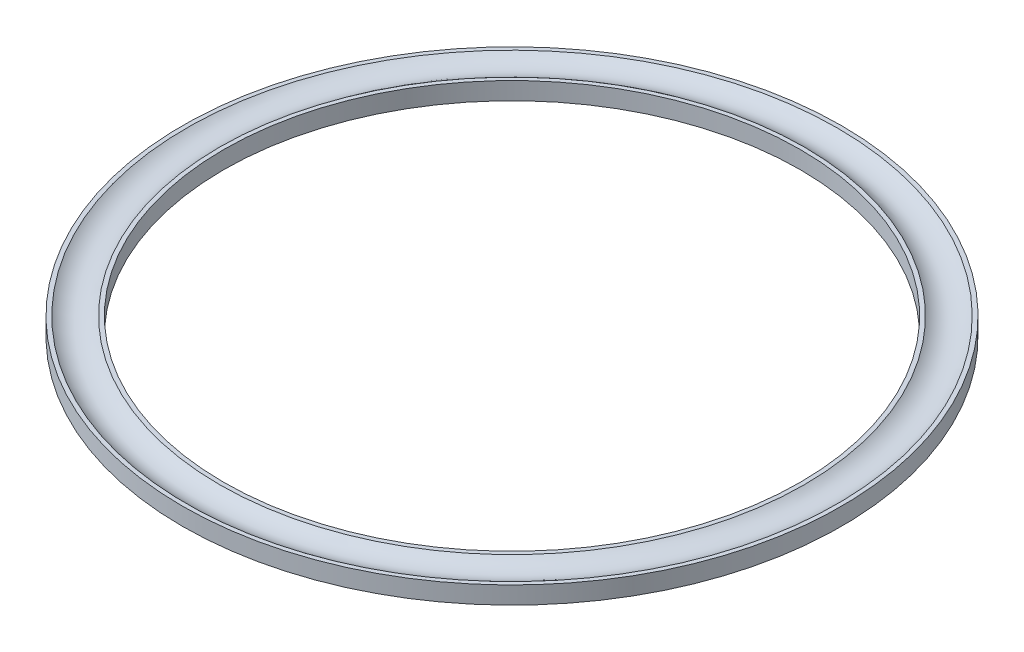
ISO-10303-21;
HEADER;
FILE_DESCRIPTION(('STEP AP214'),'2;1');
FILE_NAME('part.step','',(''),(''),'','','');
FILE_SCHEMA(('AUTOMOTIVE_DESIGN { 1 0 10303 214 1 1 1 1 }'));
ENDSEC;
DATA;
#1=APPLICATION_CONTEXT('core data for automotive mechanical design processes');
#2=APPLICATION_PROTOCOL_DEFINITION('international standard','automotive_design',2000,#1);
#3=PRODUCT_CONTEXT('',#1,'mechanical');
#4=PRODUCT('Part','Part','',(#3));
#5=PRODUCT_RELATED_PRODUCT_CATEGORY('part','',(#4));
#6=PRODUCT_DEFINITION_FORMATION('','',#4);
#7=PRODUCT_DEFINITION_CONTEXT('part definition',#1,'design');
#8=PRODUCT_DEFINITION('design','',#6,#7);
#9=PRODUCT_DEFINITION_SHAPE('','',#8);
#10=(LENGTH_UNIT() NAMED_UNIT(*) SI_UNIT(.MILLI.,.METRE.));
#11=(NAMED_UNIT(*) PLANE_ANGLE_UNIT() SI_UNIT($,.RADIAN.));
#12=(NAMED_UNIT(*) SI_UNIT($,.STERADIAN.) SOLID_ANGLE_UNIT());
#13=UNCERTAINTY_MEASURE_WITH_UNIT(LENGTH_MEASURE(1.E-05),#10,'distance_accuracy_value','');
#14=(GEOMETRIC_REPRESENTATION_CONTEXT(3) GLOBAL_UNCERTAINTY_ASSIGNED_CONTEXT((#13)) GLOBAL_UNIT_ASSIGNED_CONTEXT((#10,
#11,#12)) REPRESENTATION_CONTEXT('',''));
#15=CARTESIAN_POINT('',(0.,0.,0.));
#16=DIRECTION('',(0.,0.,1.));
#17=DIRECTION('',(1.,0.,0.));
#18=AXIS2_PLACEMENT_3D('',#15,#16,#17);
#19=CARTESIAN_POINT('',(23.9141,0.634999999999999,0.));
#20=DIRECTION('',(0.,1.,0.));
#21=DIRECTION('',(0.,0.,1.));
#22=AXIS2_PLACEMENT_3D('',#19,#20,#21);
#23=PLANE('',#22);
#24=CARTESIAN_POINT('',(0.,0.634999999999998,0.));
#25=DIRECTION('',(0.,-1.,0.));
#26=DIRECTION('',(0.,0.,-1.));
#27=AXIS2_PLACEMENT_3D('',#24,#25,#26);
#28=CIRCLE('',#27,23.61438);
#29=CARTESIAN_POINT('',(0.,0.634999999999998,-23.61438));
#30=VERTEX_POINT('',#29);
#31=EDGE_CURVE('E10',#30,#30,#28,.T.);
#32=ORIENTED_EDGE('',*,*,#31,.T.);
#33=EDGE_LOOP('',(#32));
#34=FACE_BOUND('',#33,.T.);
#35=CARTESIAN_POINT('',(0.,0.635,0.));
#36=DIRECTION('',(0.,-1.,0.));
#37=DIRECTION('',(0.,0.,-1.));
#38=AXIS2_PLACEMENT_3D('',#35,#36,#37);
#39=CIRCLE('',#38,23.9141);
#40=CARTESIAN_POINT('',(0.,0.635,-23.9141));
#41=VERTEX_POINT('',#40);
#42=EDGE_CURVE('E54',#41,#41,#39,.T.);
#43=ORIENTED_EDGE('',*,*,#42,.F.);
#44=EDGE_LOOP('',(#43));
#45=FACE_BOUND('',#44,.T.);
#46=ADVANCED_FACE('F32',(#34,#45),#23,.T.);
#47=CARTESIAN_POINT('',(0.,2.04008712643679,0.));
#48=DIRECTION('',(0.,-1.,0.));
#49=DIRECTION('',(0.,0.,-1.));
#50=AXIS2_PLACEMENT_3D('',#47,#48,#49);
#51=TOROIDAL_SURFACE('',#50,22.4155,1.84704712643679);
#52=CARTESIAN_POINT('',(0.,0.634999999999998,0.));
#53=DIRECTION('',(0.,-1.,0.));
#54=DIRECTION('',(0.,0.,-1.));
#55=AXIS2_PLACEMENT_3D('',#52,#53,#54);
#56=CIRCLE('',#55,21.21662);
#57=CARTESIAN_POINT('',(0.,0.634999999999998,-21.21662));
#58=VERTEX_POINT('',#57);
#59=EDGE_CURVE('E38',#58,#58,#56,.T.);
#60=ORIENTED_EDGE('',*,*,#59,.T.);
#61=EDGE_LOOP('',(#60));
#62=FACE_BOUND('',#61,.T.);
#63=ORIENTED_EDGE('',*,*,#31,.F.);
#64=EDGE_LOOP('',(#63));
#65=FACE_BOUND('',#64,.T.);
#66=ADVANCED_FACE('F62',(#62,#65),#51,.F.);
#67=CARTESIAN_POINT('',(20.9169,0.634999999999999,0.));
#68=DIRECTION('',(0.,1.,0.));
#69=DIRECTION('',(0.,0.,1.));
#70=AXIS2_PLACEMENT_3D('',#67,#68,#69);
#71=PLANE('',#70);
#72=CARTESIAN_POINT('',(0.,0.635,0.));
#73=DIRECTION('',(0.,-1.,0.));
#74=DIRECTION('',(0.,0.,-1.));
#75=AXIS2_PLACEMENT_3D('',#72,#73,#74);
#76=CIRCLE('',#75,20.9169);
#77=CARTESIAN_POINT('',(0.,0.635,-20.9169));
#78=VERTEX_POINT('',#77);
#79=EDGE_CURVE('E42',#78,#78,#76,.T.);
#80=ORIENTED_EDGE('',*,*,#79,.T.);
#81=EDGE_LOOP('',(#80));
#82=FACE_BOUND('',#81,.T.);
#83=ORIENTED_EDGE('',*,*,#59,.F.);
#84=EDGE_LOOP('',(#83));
#85=FACE_BOUND('',#84,.T.);
#86=ADVANCED_FACE('F66',(#82,#85),#71,.T.);
#87=CARTESIAN_POINT('',(0.,-11.4126253664222,0.));
#88=DIRECTION('',(0.,-1.,0.));
#89=DIRECTION('',(0.,0.,-1.));
#90=AXIS2_PLACEMENT_3D('',#87,#88,#89);
#91=CYLINDRICAL_SURFACE('',#90,20.9169);
#92=CARTESIAN_POINT('',(0.,-0.635,0.));
#93=DIRECTION('',(0.,-1.,0.));
#94=DIRECTION('',(0.,0.,-1.));
#95=AXIS2_PLACEMENT_3D('',#92,#93,#94);
#96=CIRCLE('',#95,20.9169);
#97=CARTESIAN_POINT('',(0.,-0.635,-20.9169));
#98=VERTEX_POINT('',#97);
#99=EDGE_CURVE('E46',#98,#98,#96,.T.);
#100=ORIENTED_EDGE('',*,*,#99,.T.);
#101=EDGE_LOOP('',(#100));
#102=FACE_BOUND('',#101,.T.);
#103=ORIENTED_EDGE('',*,*,#79,.F.);
#104=EDGE_LOOP('',(#103));
#105=FACE_BOUND('',#104,.T.);
#106=ADVANCED_FACE('F70',(#102,#105),#91,.F.);
#107=CARTESIAN_POINT('',(23.9141,-0.635,0.));
#108=DIRECTION('',(0.,-1.,0.));
#109=DIRECTION('',(0.,0.,-1.));
#110=AXIS2_PLACEMENT_3D('',#107,#108,#109);
#111=PLANE('',#110);
#112=CARTESIAN_POINT('',(0.,-0.635,0.));
#113=DIRECTION('',(0.,-1.,0.));
#114=DIRECTION('',(0.,0.,-1.));
#115=AXIS2_PLACEMENT_3D('',#112,#113,#114);
#116=CIRCLE('',#115,23.9141);
#117=CARTESIAN_POINT('',(0.,-0.635,-23.9141));
#118=VERTEX_POINT('',#117);
#119=EDGE_CURVE('E51',#118,#118,#116,.T.);
#120=ORIENTED_EDGE('',*,*,#119,.T.);
#121=EDGE_LOOP('',(#120));
#122=FACE_BOUND('',#121,.T.);
#123=ORIENTED_EDGE('',*,*,#99,.F.);
#124=EDGE_LOOP('',(#123));
#125=FACE_BOUND('',#124,.T.);
#126=ADVANCED_FACE('F77',(#122,#125),#111,.T.);
#127=CARTESIAN_POINT('',(0.,-11.4126253664222,0.));
#128=DIRECTION('',(0.,-1.,0.));
#129=DIRECTION('',(0.,0.,-1.));
#130=AXIS2_PLACEMENT_3D('',#127,#128,#129);
#131=CYLINDRICAL_SURFACE('',#130,23.9141);
#132=ORIENTED_EDGE('',*,*,#42,.T.);
#133=EDGE_LOOP('',(#132));
#134=FACE_BOUND('',#133,.T.);
#135=ORIENTED_EDGE('',*,*,#119,.F.);
#136=EDGE_LOOP('',(#135));
#137=FACE_BOUND('',#136,.T.);
#138=ADVANCED_FACE('F58',(#134,#137),#131,.T.);
#139=CLOSED_SHELL('',(#46,#66,#86,#106,#126,#138));
#140=MANIFOLD_SOLID_BREP('B2',#139);
#141=ADVANCED_BREP_SHAPE_REPRESENTATION('',(#18,#140),#14);
#142=SHAPE_DEFINITION_REPRESENTATION(#9,#141);
ENDSEC;
END-ISO-10303-21;
